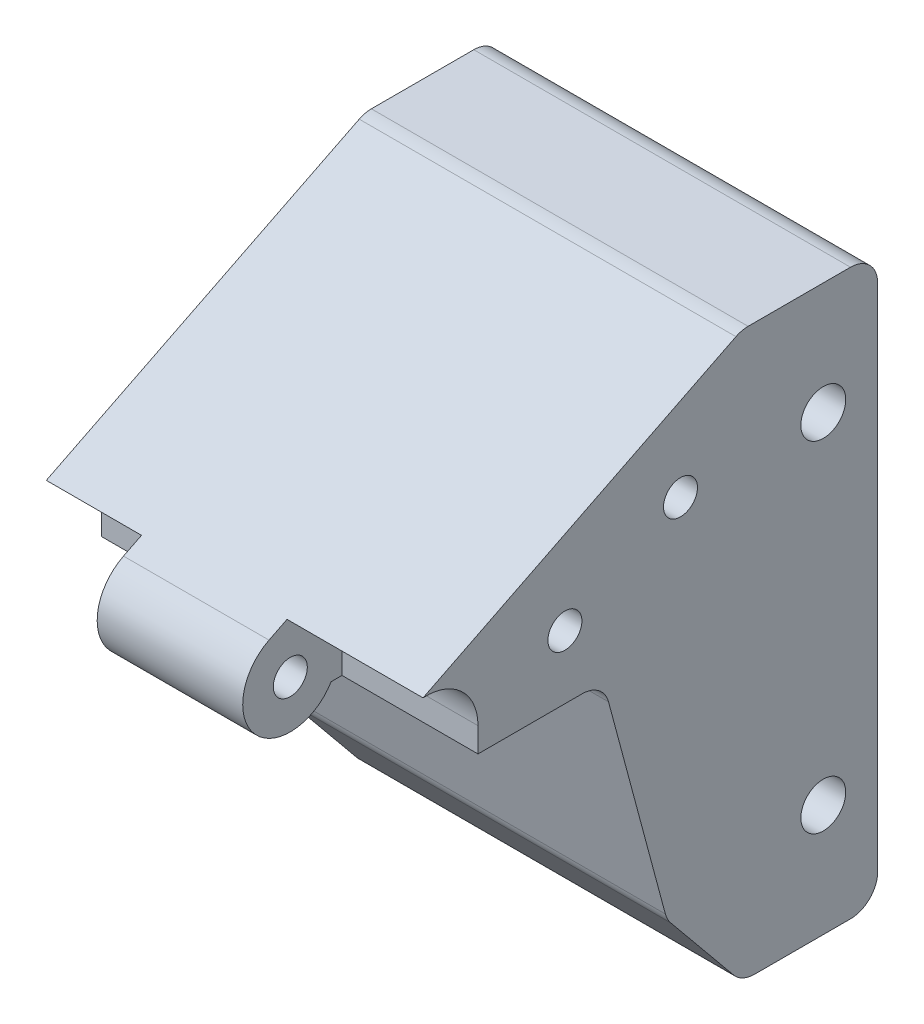
ISO-10303-21;
HEADER;
FILE_DESCRIPTION(('STEP AP214'),'2;1');
FILE_NAME('part.step','',(''),(''),'','','');
FILE_SCHEMA(('AUTOMOTIVE_DESIGN { 1 0 10303 214 1 1 1 1 }'));
ENDSEC;
DATA;
#1=APPLICATION_CONTEXT('core data for automotive mechanical design processes');
#2=APPLICATION_PROTOCOL_DEFINITION('international standard','automotive_design',2000,#1);
#3=PRODUCT_CONTEXT('',#1,'mechanical');
#4=PRODUCT('Part','Part','',(#3));
#5=PRODUCT_RELATED_PRODUCT_CATEGORY('part','',(#4));
#6=PRODUCT_DEFINITION_FORMATION('','',#4);
#7=PRODUCT_DEFINITION_CONTEXT('part definition',#1,'design');
#8=PRODUCT_DEFINITION('design','',#6,#7);
#9=PRODUCT_DEFINITION_SHAPE('','',#8);
#10=(LENGTH_UNIT() NAMED_UNIT(*) SI_UNIT(.MILLI.,.METRE.));
#11=(NAMED_UNIT(*) PLANE_ANGLE_UNIT() SI_UNIT($,.RADIAN.));
#12=(NAMED_UNIT(*) SI_UNIT($,.STERADIAN.) SOLID_ANGLE_UNIT());
#13=UNCERTAINTY_MEASURE_WITH_UNIT(LENGTH_MEASURE(1.E-05),#10,'distance_accuracy_value','');
#14=(GEOMETRIC_REPRESENTATION_CONTEXT(3) GLOBAL_UNCERTAINTY_ASSIGNED_CONTEXT((#13)) GLOBAL_UNIT_ASSIGNED_CONTEXT((#10,
#11,#12)) REPRESENTATION_CONTEXT('',''));
#15=CARTESIAN_POINT('',(0.,0.,0.));
#16=DIRECTION('',(0.,0.,1.));
#17=DIRECTION('',(1.,0.,0.));
#18=AXIS2_PLACEMENT_3D('',#15,#16,#17);
#19=CARTESIAN_POINT('',(-63.1917277768017,5.25000000000001,33.19));
#20=DIRECTION('',(1.,0.,0.));
#21=DIRECTION('',(0.,0.,-1.));
#22=AXIS2_PLACEMENT_3D('',#19,#20,#21);
#23=CYLINDRICAL_SURFACE('',#22,3.5);
#24=DIRECTION('',(1.,0.,0.));
#25=VECTOR('',#24,1.);
#26=CARTESIAN_POINT('',(-63.1917277768017,3.45000000000001,30.1883337960393));
#27=LINE('',#26,#25);
#28=CARTESIAN_POINT('',(-6.85,3.45000000000001,30.1883337960393));
#29=VERTEX_POINT('',#28);
#30=CARTESIAN_POINT('',(3.84999999999999,3.45000000000001,30.1883337960393));
#31=VERTEX_POINT('',#30);
#32=EDGE_CURVE('E251',#29,#31,#27,.T.);
#33=ORIENTED_EDGE('',*,*,#32,.T.);
#34=CARTESIAN_POINT('',(3.84999999999999,5.25000000000001,33.19));
#35=DIRECTION('',(1.,0.,0.));
#36=DIRECTION('',(0.,1.,0.));
#37=AXIS2_PLACEMENT_3D('',#34,#35,#36);
#38=CIRCLE('',#37,3.5);
#39=CARTESIAN_POINT('',(3.84999999999999,8.38090580389375,34.7544260439997));
#40=VERTEX_POINT('',#39);
#41=EDGE_CURVE('E180',#31,#40,#38,.F.);
#42=ORIENTED_EDGE('',*,*,#41,.T.);
#43=DIRECTION('',(1.,0.,0.));
#44=VECTOR('',#43,1.);
#45=CARTESIAN_POINT('',(-63.1917277768017,8.38090580389375,34.7544260439997));
#46=LINE('',#45,#44);
#47=CARTESIAN_POINT('',(-6.85,8.38090580389374,34.7544260439997));
#48=VERTEX_POINT('',#47);
#49=EDGE_CURVE('E245',#48,#40,#46,.T.);
#50=ORIENTED_EDGE('',*,*,#49,.F.);
#51=CARTESIAN_POINT('',(-6.85,5.25000000000001,33.19));
#52=DIRECTION('',(-1.,0.,0.));
#53=DIRECTION('',(0.,-1.,0.));
#54=AXIS2_PLACEMENT_3D('',#51,#52,#53);
#55=CIRCLE('',#54,3.5);
#56=EDGE_CURVE('E229',#48,#29,#55,.F.);
#57=ORIENTED_EDGE('',*,*,#56,.T.);
#58=EDGE_LOOP('',(#33,#42,#50,#57));
#59=FACE_BOUND('',#58,.T.);
#60=ADVANCED_FACE('F38',(#59),#23,.T.);
#61=CARTESIAN_POINT('',(-63.1917277768017,5.25000000000001,33.19));
#62=DIRECTION('',(1.,0.,0.));
#63=DIRECTION('',(0.,0.,-1.));
#64=AXIS2_PLACEMENT_3D('',#61,#62,#63);
#65=CYLINDRICAL_SURFACE('',#64,1.25);
#66=CARTESIAN_POINT('',(-6.85,5.25000000000001,33.19));
#67=DIRECTION('',(-1.,0.,0.));
#68=DIRECTION('',(0.,-1.,0.));
#69=AXIS2_PLACEMENT_3D('',#66,#67,#68);
#70=CIRCLE('',#69,1.25);
#71=CARTESIAN_POINT('',(-6.85,4.00000000000001,33.19));
#72=VERTEX_POINT('',#71);
#73=EDGE_CURVE('E215',#72,#72,#70,.F.);
#74=ORIENTED_EDGE('',*,*,#73,.F.);
#75=EDGE_LOOP('',(#74));
#76=FACE_BOUND('',#75,.T.);
#77=CARTESIAN_POINT('',(3.85,5.25000000000001,33.19));
#78=DIRECTION('',(1.,0.,0.));
#79=DIRECTION('',(0.,1.,0.));
#80=AXIS2_PLACEMENT_3D('',#77,#78,#79);
#81=CIRCLE('',#80,1.25);
#82=CARTESIAN_POINT('',(3.85,6.50000000000001,33.19));
#83=VERTEX_POINT('',#82);
#84=EDGE_CURVE('E195',#83,#83,#81,.F.);
#85=ORIENTED_EDGE('',*,*,#84,.F.);
#86=EDGE_LOOP('',(#85));
#87=FACE_BOUND('',#86,.T.);
#88=ADVANCED_FACE('F416',(#76,#87),#65,.F.);
#89=CARTESIAN_POINT('',(-63.1917277768017,3.45000000000001,0.));
#90=DIRECTION('',(0.,-1.,0.));
#91=DIRECTION('',(0.,0.,-1.));
#92=AXIS2_PLACEMENT_3D('',#89,#90,#91);
#93=PLANE('',#92);
#94=DIRECTION('',(0.,0.,1.));
#95=VECTOR('',#94,1.);
#96=CARTESIAN_POINT('',(-13.85,3.45000000000001,0.));
#97=LINE('',#96,#95);
#98=CARTESIAN_POINT('',(-13.85,3.45000000000001,21.7230535966999));
#99=VERTEX_POINT('',#98);
#100=CARTESIAN_POINT('',(-13.85,3.45000000000001,29.39));
#101=VERTEX_POINT('',#100);
#102=EDGE_CURVE('E253',#99,#101,#97,.T.);
#103=ORIENTED_EDGE('',*,*,#102,.F.);
#104=DIRECTION('',(1.,0.,0.));
#105=VECTOR('',#104,1.);
#106=CARTESIAN_POINT('',(-63.1917277768017,3.45000000000001,21.7230535966999));
#107=LINE('',#106,#105);
#108=CARTESIAN_POINT('',(13.85,3.45000000000001,21.7230535966999));
#109=VERTEX_POINT('',#108);
#110=EDGE_CURVE('E333',#99,#109,#107,.T.);
#111=ORIENTED_EDGE('',*,*,#110,.T.);
#112=DIRECTION('',(0.,0.,1.));
#113=VECTOR('',#112,1.);
#114=CARTESIAN_POINT('',(13.85,3.45000000000001,0.));
#115=LINE('',#114,#113);
#116=CARTESIAN_POINT('',(13.85,3.45000000000001,29.39));
#117=VERTEX_POINT('',#116);
#118=EDGE_CURVE('E200',#109,#117,#115,.T.);
#119=ORIENTED_EDGE('',*,*,#118,.T.);
#120=DIRECTION('',(1.,0.,0.));
#121=VECTOR('',#120,1.);
#122=CARTESIAN_POINT('',(3.85,3.45000000000001,29.39));
#123=LINE('',#122,#121);
#124=CARTESIAN_POINT('',(3.85,3.45000000000001,29.39));
#125=VERTEX_POINT('',#124);
#126=EDGE_CURVE('E191',#125,#117,#123,.T.);
#127=ORIENTED_EDGE('',*,*,#126,.F.);
#128=DIRECTION('',(0.,0.,-1.));
#129=VECTOR('',#128,1.);
#130=CARTESIAN_POINT('',(3.85,3.45000000000001,0.));
#131=LINE('',#130,#129);
#132=EDGE_CURVE('E174',#31,#125,#131,.T.);
#133=ORIENTED_EDGE('',*,*,#132,.F.);
#134=ORIENTED_EDGE('',*,*,#32,.F.);
#135=DIRECTION('',(0.,0.,-1.));
#136=VECTOR('',#135,1.);
#137=CARTESIAN_POINT('',(-6.85,3.45000000000001,0.));
#138=LINE('',#137,#136);
#139=CARTESIAN_POINT('',(-6.85,3.45000000000001,29.39));
#140=VERTEX_POINT('',#139);
#141=EDGE_CURVE('E225',#29,#140,#138,.T.);
#142=ORIENTED_EDGE('',*,*,#141,.T.);
#143=DIRECTION('',(-1.,0.,0.));
#144=VECTOR('',#143,1.);
#145=CARTESIAN_POINT('',(-6.85,3.45000000000001,29.39));
#146=LINE('',#145,#144);
#147=EDGE_CURVE('E222',#140,#101,#146,.T.);
#148=ORIENTED_EDGE('',*,*,#147,.T.);
#149=EDGE_LOOP('',(#103,#111,#119,#127,#133,#134,#142,#148));
#150=FACE_BOUND('',#149,.T.);
#151=ADVANCED_FACE('F197',(#150),#93,.T.);
#152=CARTESIAN_POINT('',(-13.85,20.75,10.));
#153=DIRECTION('',(1.,0.,0.));
#154=DIRECTION('',(0.,1.,0.));
#155=AXIS2_PLACEMENT_3D('',#152,#153,#154);
#156=PLANE('',#155);
#157=CARTESIAN_POINT('',(-13.85,8.10626133417407,22.9992433006019));
#158=DIRECTION('',(-1.,0.,0.));
#159=DIRECTION('',(0.,-1.,0.));
#160=AXIS2_PLACEMENT_3D('',#157,#158,#159);
#161=CIRCLE('',#160,1.25);
#162=CARTESIAN_POINT('',(-13.85,6.85626133417407,22.9992433006019));
#163=VERTEX_POINT('',#162);
#164=EDGE_CURVE('E458',#163,#163,#161,.T.);
#165=ORIENTED_EDGE('',*,*,#164,.F.);
#166=EDGE_LOOP('',(#165));
#167=FACE_BOUND('',#166,.T.);
#168=CARTESIAN_POINT('',(-13.85,12.3530954475528,14.5));
#169=DIRECTION('',(-1.,0.,0.));
#170=DIRECTION('',(0.,-1.,0.));
#171=AXIS2_PLACEMENT_3D('',#168,#169,#170);
#172=CIRCLE('',#171,1.25);
#173=CARTESIAN_POINT('',(-13.85,11.1030954475528,14.5));
#174=VERTEX_POINT('',#173);
#175=EDGE_CURVE('E462',#174,#174,#172,.T.);
#176=ORIENTED_EDGE('',*,*,#175,.F.);
#177=EDGE_LOOP('',(#176));
#178=FACE_BOUND('',#177,.T.);
#179=CARTESIAN_POINT('',(-13.85,-12.5,4.));
#180=DIRECTION('',(1.,0.,0.));
#181=DIRECTION('',(0.,0.,-1.));
#182=AXIS2_PLACEMENT_3D('',#179,#180,#181);
#183=CIRCLE('',#182,1.65);
#184=CARTESIAN_POINT('',(-13.85,-12.5,2.35));
#185=VERTEX_POINT('',#184);
#186=EDGE_CURVE('E257',#185,#185,#183,.T.);
#187=ORIENTED_EDGE('',*,*,#186,.T.);
#188=EDGE_LOOP('',(#187));
#189=FACE_BOUND('',#188,.T.);
#190=CARTESIAN_POINT('',(-13.85,12.5,4.));
#191=DIRECTION('',(1.,0.,0.));
#192=DIRECTION('',(0.,0.,-1.));
#193=AXIS2_PLACEMENT_3D('',#190,#191,#192);
#194=CIRCLE('',#193,1.65);
#195=CARTESIAN_POINT('',(-13.85,12.5,2.35));
#196=VERTEX_POINT('',#195);
#197=EDGE_CURVE('E269',#196,#196,#194,.T.);
#198=ORIENTED_EDGE('',*,*,#197,.T.);
#199=EDGE_LOOP('',(#198));
#200=FACE_BOUND('',#199,.T.);
#201=DIRECTION('',(0.,0.,-1.));
#202=VECTOR('',#201,1.);
#203=CARTESIAN_POINT('',(-13.85,-20.75,10.));
#204=LINE('',#203,#202);
#205=CARTESIAN_POINT('',(-13.85,-20.75,9.05422890354993));
#206=VERTEX_POINT('',#205);
#207=CARTESIAN_POINT('',(-13.85,-20.75,2.));
#208=VERTEX_POINT('',#207);
#209=EDGE_CURVE('E287',#206,#208,#204,.T.);
#210=ORIENTED_EDGE('',*,*,#209,.F.);
#211=CARTESIAN_POINT('',(-13.85,-18.75,9.05422890354993));
#212=DIRECTION('',(1.,0.,0.));
#213=DIRECTION('',(0.,1.,0.));
#214=AXIS2_PLACEMENT_3D('',#211,#212,#213);
#215=CIRCLE('',#214,2.);
#216=CARTESIAN_POINT('',(-13.85,-20.0189867567765,10.6000854981686));
#217=VERTEX_POINT('',#216);
#218=EDGE_CURVE('E322',#206,#217,#215,.F.);
#219=ORIENTED_EDGE('',*,*,#218,.T.);
#220=DIRECTION('',(0.,-0.772928297309314,-0.634493378388243));
#221=VECTOR('',#220,1.);
#222=CARTESIAN_POINT('',(-13.85,-13.257752195901,16.1503526750067));
#223=LINE('',#222,#221);
#224=CARTESIAN_POINT('',(-13.85,-14.3840113005057,15.2258116189879));
#225=VERTEX_POINT('',#224);
#226=EDGE_CURVE('E247',#225,#217,#223,.T.);
#227=ORIENTED_EDGE('',*,*,#226,.F.);
#228=CARTESIAN_POINT('',(-13.85,-13.1150245437292,13.6799550243692));
#229=DIRECTION('',(1.,0.,0.));
#230=DIRECTION('',(0.,1.,0.));
#231=AXIS2_PLACEMENT_3D('',#228,#229,#230);
#232=CIRCLE('',#231,2.);
#233=CARTESIAN_POINT('',(-13.85,-13.6325825968062,15.6118281210542));
#234=VERTEX_POINT('',#233);
#235=EDGE_CURVE('E57',#225,#234,#232,.F.);
#236=ORIENTED_EDGE('',*,*,#235,.T.);
#237=DIRECTION('',(0.,-0.965936548342484,-0.258779026538491));
#238=VECTOR('',#237,1.);
#239=CARTESIAN_POINT('',(-13.85,-4.815324368305,17.9740138205449));
#240=LINE('',#239,#238);
#241=CARTESIAN_POINT('',(-13.85,1.96755805307699,19.791180500015));
#242=VERTEX_POINT('',#241);
#243=EDGE_CURVE('E255',#242,#234,#240,.T.);
#244=ORIENTED_EDGE('',*,*,#243,.F.);
#245=CARTESIAN_POINT('',(-13.85,1.45000000000001,21.7230535966999));
#246=DIRECTION('',(1.,0.,0.));
#247=DIRECTION('',(0.,1.,0.));
#248=AXIS2_PLACEMENT_3D('',#245,#246,#247);
#249=CIRCLE('',#248,2.);
#250=EDGE_CURVE('E11',#242,#99,#249,.T.);
#251=ORIENTED_EDGE('',*,*,#250,.T.);
#252=ORIENTED_EDGE('',*,*,#102,.T.);
#253=DIRECTION('',(0.,1.,0.));
#254=VECTOR('',#253,1.);
#255=CARTESIAN_POINT('',(-13.85,0.,29.39));
#256=LINE('',#255,#254);
#257=CARTESIAN_POINT('',(-13.85,5.25000000000001,29.39));
#258=VERTEX_POINT('',#257);
#259=EDGE_CURVE('E212',#101,#258,#256,.T.);
#260=ORIENTED_EDGE('',*,*,#259,.T.);
#261=CARTESIAN_POINT('',(-13.85,5.25000000000001,33.19));
#262=DIRECTION('',(-1.,0.,0.));
#263=DIRECTION('',(0.,-1.,0.));
#264=AXIS2_PLACEMENT_3D('',#261,#262,#263);
#265=CIRCLE('',#264,3.8);
#266=CARTESIAN_POINT('',(-13.85,9.04237412576294,33.4306210511236));
#267=VERTEX_POINT('',#266);
#268=EDGE_CURVE('E208',#267,#258,#265,.T.);
#269=ORIENTED_EDGE('',*,*,#268,.F.);
#270=DIRECTION('',(0.,-0.446978869714198,0.89454451539821));
#271=VECTOR('',#270,1.);
#272=CARTESIAN_POINT('',(-13.85,20.6027801821194,10.2946329000457));
#273=LINE('',#272,#271);
#274=CARTESIAN_POINT('',(-13.85,20.5390890307964,10.4220988138858));
#275=VERTEX_POINT('',#274);
#276=EDGE_CURVE('E250',#275,#267,#273,.T.);
#277=ORIENTED_EDGE('',*,*,#276,.F.);
#278=CARTESIAN_POINT('',(-13.85,18.75,9.52814107445743));
#279=DIRECTION('',(1.,0.,0.));
#280=DIRECTION('',(0.,1.,0.));
#281=AXIS2_PLACEMENT_3D('',#278,#279,#280);
#282=CIRCLE('',#281,2.);
#283=CARTESIAN_POINT('',(-13.85,20.75,9.52814107445743));
#284=VERTEX_POINT('',#283);
#285=EDGE_CURVE('E315',#275,#284,#282,.F.);
#286=ORIENTED_EDGE('',*,*,#285,.T.);
#287=DIRECTION('',(0.,0.,-1.));
#288=VECTOR('',#287,1.);
#289=CARTESIAN_POINT('',(-13.85,20.75,10.));
#290=LINE('',#289,#288);
#291=CARTESIAN_POINT('',(-13.85,20.75,2.));
#292=VERTEX_POINT('',#291);
#293=EDGE_CURVE('E278',#284,#292,#290,.T.);
#294=ORIENTED_EDGE('',*,*,#293,.T.);
#295=CARTESIAN_POINT('',(-13.85,18.75,2.));
#296=DIRECTION('',(1.,0.,0.));
#297=DIRECTION('',(0.,1.,0.));
#298=AXIS2_PLACEMENT_3D('',#295,#296,#297);
#299=CIRCLE('',#298,2.);
#300=CARTESIAN_POINT('',(-13.85,18.75,0.));
#301=VERTEX_POINT('',#300);
#302=EDGE_CURVE('E317',#292,#301,#299,.F.);
#303=ORIENTED_EDGE('',*,*,#302,.T.);
#304=DIRECTION('',(0.,-1.,0.));
#305=VECTOR('',#304,1.);
#306=CARTESIAN_POINT('',(-13.85,20.75,0.));
#307=LINE('',#306,#305);
#308=CARTESIAN_POINT('',(-13.85,-18.75,0.));
#309=VERTEX_POINT('',#308);
#310=EDGE_CURVE('E272',#301,#309,#307,.T.);
#311=ORIENTED_EDGE('',*,*,#310,.T.);
#312=CARTESIAN_POINT('',(-13.85,-18.75,2.));
#313=DIRECTION('',(1.,0.,0.));
#314=DIRECTION('',(0.,1.,0.));
#315=AXIS2_PLACEMENT_3D('',#312,#313,#314);
#316=CIRCLE('',#315,2.);
#317=EDGE_CURVE('E319',#309,#208,#316,.F.);
#318=ORIENTED_EDGE('',*,*,#317,.T.);
#319=EDGE_LOOP('',(#210,#219,#227,#236,#244,#251,#252,#260,#269,#277,#286,#294,#303,#311,#318));
#320=FACE_BOUND('',#319,.T.);
#321=ADVANCED_FACE('F355',(#167,#178,#189,#200,#320),#156,.F.);
#322=CARTESIAN_POINT('',(13.85,-20.75,10.));
#323=DIRECTION('',(0.,1.,0.));
#324=DIRECTION('',(-1.,0.,0.));
#325=AXIS2_PLACEMENT_3D('',#322,#323,#324);
#326=PLANE('',#325);
#327=DIRECTION('',(0.,0.,-1.));
#328=VECTOR('',#327,1.);
#329=CARTESIAN_POINT('',(13.85,-20.75,10.));
#330=LINE('',#329,#328);
#331=CARTESIAN_POINT('',(13.85,-20.75,9.05422890354993));
#332=VERTEX_POINT('',#331);
#333=CARTESIAN_POINT('',(13.85,-20.75,2.));
#334=VERTEX_POINT('',#333);
#335=EDGE_CURVE('E284',#332,#334,#330,.T.);
#336=ORIENTED_EDGE('',*,*,#335,.F.);
#337=DIRECTION('',(1.,0.,0.));
#338=VECTOR('',#337,1.);
#339=CARTESIAN_POINT('',(13.85,-20.75,9.05422890354993));
#340=LINE('',#339,#338);
#341=EDGE_CURVE('E313',#332,#206,#340,.F.);
#342=ORIENTED_EDGE('',*,*,#341,.T.);
#343=ORIENTED_EDGE('',*,*,#209,.T.);
#344=DIRECTION('',(1.,0.,0.));
#345=VECTOR('',#344,1.);
#346=CARTESIAN_POINT('',(13.85,-20.75,2.));
#347=LINE('',#346,#345);
#348=EDGE_CURVE('E310',#208,#334,#347,.T.);
#349=ORIENTED_EDGE('',*,*,#348,.T.);
#350=EDGE_LOOP('',(#336,#342,#343,#349));
#351=FACE_BOUND('',#350,.T.);
#352=ADVANCED_FACE('F395',(#351),#326,.F.);
#353=CARTESIAN_POINT('',(13.85,20.75,10.));
#354=DIRECTION('',(-1.,0.,0.));
#355=DIRECTION('',(0.,-1.,0.));
#356=AXIS2_PLACEMENT_3D('',#353,#354,#355);
#357=PLANE('',#356);
#358=CARTESIAN_POINT('',(13.85,8.10626133417408,22.9992433006019));
#359=DIRECTION('',(-1.,0.,0.));
#360=DIRECTION('',(0.,-1.,0.));
#361=AXIS2_PLACEMENT_3D('',#358,#359,#360);
#362=CIRCLE('',#361,1.25);
#363=CARTESIAN_POINT('',(13.85,6.85626133417407,22.9992433006019));
#364=VERTEX_POINT('',#363);
#365=EDGE_CURVE('E474',#364,#364,#362,.T.);
#366=ORIENTED_EDGE('',*,*,#365,.T.);
#367=EDGE_LOOP('',(#366));
#368=FACE_BOUND('',#367,.T.);
#369=CARTESIAN_POINT('',(13.85,12.3530954475528,14.5));
#370=DIRECTION('',(-1.,0.,0.));
#371=DIRECTION('',(0.,-1.,0.));
#372=AXIS2_PLACEMENT_3D('',#369,#370,#371);
#373=CIRCLE('',#372,1.25);
#374=CARTESIAN_POINT('',(13.85,11.1030954475528,14.5));
#375=VERTEX_POINT('',#374);
#376=EDGE_CURVE('E473',#375,#375,#373,.T.);
#377=ORIENTED_EDGE('',*,*,#376,.T.);
#378=EDGE_LOOP('',(#377));
#379=FACE_BOUND('',#378,.T.);
#380=CARTESIAN_POINT('',(13.85,-12.5,4.));
#381=DIRECTION('',(1.,0.,0.));
#382=DIRECTION('',(0.,0.,-1.));
#383=AXIS2_PLACEMENT_3D('',#380,#381,#382);
#384=CIRCLE('',#383,1.65);
#385=CARTESIAN_POINT('',(13.85,-12.5,2.35));
#386=VERTEX_POINT('',#385);
#387=EDGE_CURVE('E263',#386,#386,#384,.T.);
#388=ORIENTED_EDGE('',*,*,#387,.F.);
#389=EDGE_LOOP('',(#388));
#390=FACE_BOUND('',#389,.T.);
#391=CARTESIAN_POINT('',(13.85,12.5,4.));
#392=DIRECTION('',(1.,0.,0.));
#393=DIRECTION('',(0.,0.,-1.));
#394=AXIS2_PLACEMENT_3D('',#391,#392,#393);
#395=CIRCLE('',#394,1.65);
#396=CARTESIAN_POINT('',(13.85,12.5,2.35));
#397=VERTEX_POINT('',#396);
#398=EDGE_CURVE('E266',#397,#397,#395,.T.);
#399=ORIENTED_EDGE('',*,*,#398,.F.);
#400=EDGE_LOOP('',(#399));
#401=FACE_BOUND('',#400,.T.);
#402=DIRECTION('',(0.,-0.772928297309314,-0.634493378388243));
#403=VECTOR('',#402,1.);
#404=CARTESIAN_POINT('',(13.85,-13.257752195901,16.1503526750066));
#405=LINE('',#404,#403);
#406=CARTESIAN_POINT('',(13.85,-14.3840113005057,15.2258116189879));
#407=VERTEX_POINT('',#406);
#408=CARTESIAN_POINT('',(13.85,-20.0189867567765,10.6000854981686));
#409=VERTEX_POINT('',#408);
#410=EDGE_CURVE('E240',#407,#409,#405,.T.);
#411=ORIENTED_EDGE('',*,*,#410,.T.);
#412=CARTESIAN_POINT('',(13.85,-18.75,9.05422890354993));
#413=DIRECTION('',(-1.,0.,0.));
#414=DIRECTION('',(0.,-1.,0.));
#415=AXIS2_PLACEMENT_3D('',#412,#413,#414);
#416=CIRCLE('',#415,2.);
#417=EDGE_CURVE('E308',#409,#332,#416,.F.);
#418=ORIENTED_EDGE('',*,*,#417,.T.);
#419=ORIENTED_EDGE('',*,*,#335,.T.);
#420=CARTESIAN_POINT('',(13.85,-18.75,2.));
#421=DIRECTION('',(-1.,0.,0.));
#422=DIRECTION('',(0.,-1.,0.));
#423=AXIS2_PLACEMENT_3D('',#420,#421,#422);
#424=CIRCLE('',#423,2.);
#425=CARTESIAN_POINT('',(13.85,-18.75,0.));
#426=VERTEX_POINT('',#425);
#427=EDGE_CURVE('E304',#334,#426,#424,.F.);
#428=ORIENTED_EDGE('',*,*,#427,.T.);
#429=DIRECTION('',(0.,1.,0.));
#430=VECTOR('',#429,1.);
#431=CARTESIAN_POINT('',(13.85,20.75,0.));
#432=LINE('',#431,#430);
#433=CARTESIAN_POINT('',(13.85,18.75,0.));
#434=VERTEX_POINT('',#433);
#435=EDGE_CURVE('E275',#426,#434,#432,.T.);
#436=ORIENTED_EDGE('',*,*,#435,.T.);
#437=CARTESIAN_POINT('',(13.85,18.75,2.));
#438=DIRECTION('',(-1.,0.,0.));
#439=DIRECTION('',(0.,-1.,0.));
#440=AXIS2_PLACEMENT_3D('',#437,#438,#439);
#441=CIRCLE('',#440,2.);
#442=CARTESIAN_POINT('',(13.85,20.75,2.));
#443=VERTEX_POINT('',#442);
#444=EDGE_CURVE('E302',#434,#443,#441,.F.);
#445=ORIENTED_EDGE('',*,*,#444,.T.);
#446=DIRECTION('',(0.,0.,-1.));
#447=VECTOR('',#446,1.);
#448=CARTESIAN_POINT('',(13.85,20.75,10.));
#449=LINE('',#448,#447);
#450=CARTESIAN_POINT('',(13.85,20.75,9.52814107445743));
#451=VERTEX_POINT('',#450);
#452=EDGE_CURVE('E281',#451,#443,#449,.T.);
#453=ORIENTED_EDGE('',*,*,#452,.F.);
#454=CARTESIAN_POINT('',(13.85,18.75,9.52814107445743));
#455=DIRECTION('',(-1.,0.,0.));
#456=DIRECTION('',(0.,-1.,0.));
#457=AXIS2_PLACEMENT_3D('',#454,#455,#456);
#458=CIRCLE('',#457,2.);
#459=CARTESIAN_POINT('',(13.85,20.5390890307964,10.4220988138858));
#460=VERTEX_POINT('',#459);
#461=EDGE_CURVE('E300',#451,#460,#458,.F.);
#462=ORIENTED_EDGE('',*,*,#461,.T.);
#463=DIRECTION('',(0.,-0.446978869714198,0.89454451539821));
#464=VECTOR('',#463,1.);
#465=CARTESIAN_POINT('',(13.85,20.6027801821194,10.2946329000457));
#466=LINE('',#465,#464);
#467=CARTESIAN_POINT('',(13.85,9.04237412576295,33.4306210511236));
#468=VERTEX_POINT('',#467);
#469=EDGE_CURVE('E243',#460,#468,#466,.T.);
#470=ORIENTED_EDGE('',*,*,#469,.T.);
#471=CARTESIAN_POINT('',(13.85,5.25000000000001,33.19));
#472=DIRECTION('',(1.,0.,0.));
#473=DIRECTION('',(0.,1.,0.));
#474=AXIS2_PLACEMENT_3D('',#471,#472,#473);
#475=CIRCLE('',#474,3.8);
#476=CARTESIAN_POINT('',(13.85,5.25000000000001,29.39));
#477=VERTEX_POINT('',#476);
#478=EDGE_CURVE('E477',#477,#468,#475,.T.);
#479=ORIENTED_EDGE('',*,*,#478,.F.);
#480=DIRECTION('',(0.,1.,0.));
#481=VECTOR('',#480,1.);
#482=CARTESIAN_POINT('',(13.85,0.,29.39));
#483=LINE('',#482,#481);
#484=EDGE_CURVE('E483',#117,#477,#483,.T.);
#485=ORIENTED_EDGE('',*,*,#484,.F.);
#486=ORIENTED_EDGE('',*,*,#118,.F.);
#487=CARTESIAN_POINT('',(13.85,1.45000000000001,21.7230535966999));
#488=DIRECTION('',(-1.,0.,0.));
#489=DIRECTION('',(0.,-1.,0.));
#490=AXIS2_PLACEMENT_3D('',#487,#488,#489);
#491=CIRCLE('',#490,2.);
#492=CARTESIAN_POINT('',(13.85,1.96755805307699,19.791180500015));
#493=VERTEX_POINT('',#492);
#494=EDGE_CURVE('E46',#109,#493,#491,.T.);
#495=ORIENTED_EDGE('',*,*,#494,.T.);
#496=DIRECTION('',(0.,-0.965936548342484,-0.258779026538491));
#497=VECTOR('',#496,1.);
#498=CARTESIAN_POINT('',(13.85,-4.81532436830501,17.9740138205449));
#499=LINE('',#498,#497);
#500=CARTESIAN_POINT('',(13.85,-13.6325825968062,15.6118281210542));
#501=VERTEX_POINT('',#500);
#502=EDGE_CURVE('E237',#493,#501,#499,.T.);
#503=ORIENTED_EDGE('',*,*,#502,.T.);
#504=CARTESIAN_POINT('',(13.85,-13.1150245437292,13.6799550243692));
#505=DIRECTION('',(-1.,0.,0.));
#506=DIRECTION('',(0.,-1.,0.));
#507=AXIS2_PLACEMENT_3D('',#504,#505,#506);
#508=CIRCLE('',#507,2.);
#509=EDGE_CURVE('E306',#501,#407,#508,.F.);
#510=ORIENTED_EDGE('',*,*,#509,.T.);
#511=EDGE_LOOP('',(#411,#418,#419,#428,#436,#445,#453,#462,#470,#479,#485,#486,#495,#503,#510));
#512=FACE_BOUND('',#511,.T.);
#513=ADVANCED_FACE('F344',(#368,#379,#390,#401,#512),#357,.F.);
#514=CARTESIAN_POINT('',(13.85,20.75,10.));
#515=DIRECTION('',(0.,-1.,0.));
#516=DIRECTION('',(0.,0.,-1.));
#517=AXIS2_PLACEMENT_3D('',#514,#515,#516);
#518=PLANE('',#517);
#519=ORIENTED_EDGE('',*,*,#452,.T.);
#520=DIRECTION('',(-1.,0.,0.));
#521=VECTOR('',#520,1.);
#522=CARTESIAN_POINT('',(-13.85,20.75,2.));
#523=LINE('',#522,#521);
#524=EDGE_CURVE('E337',#443,#292,#523,.T.);
#525=ORIENTED_EDGE('',*,*,#524,.T.);
#526=ORIENTED_EDGE('',*,*,#293,.F.);
#527=DIRECTION('',(-1.,0.,0.));
#528=VECTOR('',#527,1.);
#529=CARTESIAN_POINT('',(13.85,20.75,9.52814107445743));
#530=LINE('',#529,#528);
#531=EDGE_CURVE('E335',#284,#451,#530,.F.);
#532=ORIENTED_EDGE('',*,*,#531,.T.);
#533=EDGE_LOOP('',(#519,#525,#526,#532));
#534=FACE_BOUND('',#533,.T.);
#535=ADVANCED_FACE('F377',(#534),#518,.F.);
#536=CARTESIAN_POINT('',(0.,0.,0.));
#537=DIRECTION('',(0.,0.,-1.));
#538=DIRECTION('',(-1.,0.,0.));
#539=AXIS2_PLACEMENT_3D('',#536,#537,#538);
#540=PLANE('',#539);
#541=ORIENTED_EDGE('',*,*,#435,.F.);
#542=DIRECTION('',(1.,0.,0.));
#543=VECTOR('',#542,1.);
#544=CARTESIAN_POINT('',(-13.85,-18.75,0.));
#545=LINE('',#544,#543);
#546=EDGE_CURVE('E331',#426,#309,#545,.F.);
#547=ORIENTED_EDGE('',*,*,#546,.T.);
#548=ORIENTED_EDGE('',*,*,#310,.F.);
#549=DIRECTION('',(-1.,0.,0.));
#550=VECTOR('',#549,1.);
#551=CARTESIAN_POINT('',(13.85,18.75,0.));
#552=LINE('',#551,#550);
#553=EDGE_CURVE('E329',#301,#434,#552,.F.);
#554=ORIENTED_EDGE('',*,*,#553,.T.);
#555=EDGE_LOOP('',(#541,#547,#548,#554));
#556=FACE_BOUND('',#555,.T.);
#557=ADVANCED_FACE('F387',(#556),#540,.T.);
#558=CARTESIAN_POINT('',(-13.85,12.5,4.));
#559=DIRECTION('',(1.,0.,0.));
#560=DIRECTION('',(0.,0.,-1.));
#561=AXIS2_PLACEMENT_3D('',#558,#559,#560);
#562=CYLINDRICAL_SURFACE('',#561,1.65);
#563=ORIENTED_EDGE('',*,*,#197,.F.);
#564=EDGE_LOOP('',(#563));
#565=FACE_BOUND('',#564,.T.);
#566=ORIENTED_EDGE('',*,*,#398,.T.);
#567=EDGE_LOOP('',(#566));
#568=FACE_BOUND('',#567,.T.);
#569=ADVANCED_FACE('F436',(#565,#568),#562,.F.);
#570=CARTESIAN_POINT('',(-13.85,-12.5,4.));
#571=DIRECTION('',(1.,0.,0.));
#572=DIRECTION('',(0.,0.,-1.));
#573=AXIS2_PLACEMENT_3D('',#570,#571,#572);
#574=CYLINDRICAL_SURFACE('',#573,1.65);
#575=ORIENTED_EDGE('',*,*,#186,.F.);
#576=EDGE_LOOP('',(#575));
#577=FACE_BOUND('',#576,.T.);
#578=ORIENTED_EDGE('',*,*,#387,.T.);
#579=EDGE_LOOP('',(#578));
#580=FACE_BOUND('',#579,.T.);
#581=ADVANCED_FACE('F431',(#577,#580),#574,.F.);
#582=CARTESIAN_POINT('',(-63.1917277768017,-13.257752195901,16.1503526750066));
#583=DIRECTION('',(0.,0.634493378388243,-0.772928297309314));
#584=DIRECTION('',(0.,0.772928297309314,0.634493378388243));
#585=AXIS2_PLACEMENT_3D('',#582,#583,#584);
#586=PLANE('',#585);
#587=ORIENTED_EDGE('',*,*,#226,.T.);
#588=DIRECTION('',(1.,0.,0.));
#589=VECTOR('',#588,1.);
#590=CARTESIAN_POINT('',(-63.1917277768017,-20.0189867567765,10.6000854981685));
#591=LINE('',#590,#589);
#592=EDGE_CURVE('E297',#217,#409,#591,.T.);
#593=ORIENTED_EDGE('',*,*,#592,.T.);
#594=ORIENTED_EDGE('',*,*,#410,.F.);
#595=DIRECTION('',(1.,0.,0.));
#596=VECTOR('',#595,1.);
#597=CARTESIAN_POINT('',(-63.1917277768017,-14.3840113005057,15.2258116189879));
#598=LINE('',#597,#596);
#599=EDGE_CURVE('E295',#407,#225,#598,.F.);
#600=ORIENTED_EDGE('',*,*,#599,.T.);
#601=EDGE_LOOP('',(#587,#593,#594,#600));
#602=FACE_BOUND('',#601,.T.);
#603=ADVANCED_FACE('F401',(#602),#586,.F.);
#604=CARTESIAN_POINT('',(-63.1917277768017,20.6027801821194,10.2946329000457));
#605=DIRECTION('',(0.,-0.89454451539821,-0.446978869714198));
#606=DIRECTION('',(0.,0.446978869714198,-0.89454451539821));
#607=AXIS2_PLACEMENT_3D('',#604,#605,#606);
#608=PLANE('',#607);
#609=ORIENTED_EDGE('',*,*,#469,.F.);
#610=DIRECTION('',(-1.,0.,0.));
#611=VECTOR('',#610,1.);
#612=CARTESIAN_POINT('',(-63.1917277768017,20.5390890307964,10.4220988138858));
#613=LINE('',#612,#611);
#614=EDGE_CURVE('E340',#460,#275,#613,.T.);
#615=ORIENTED_EDGE('',*,*,#614,.T.);
#616=ORIENTED_EDGE('',*,*,#276,.T.);
#617=DIRECTION('',(-1.,0.,0.));
#618=VECTOR('',#617,1.);
#619=CARTESIAN_POINT('',(-6.85,9.04237412576294,33.4306210511236));
#620=LINE('',#619,#618);
#621=CARTESIAN_POINT('',(-6.85,9.04237412576294,33.4306210511237));
#622=VERTEX_POINT('',#621);
#623=EDGE_CURVE('E234',#267,#622,#620,.F.);
#624=ORIENTED_EDGE('',*,*,#623,.T.);
#625=DIRECTION('',(0.,0.446978869714198,-0.89454451539821));
#626=VECTOR('',#625,1.);
#627=CARTESIAN_POINT('',(-6.85,20.6027801821194,10.2946329000457));
#628=LINE('',#627,#626);
#629=EDGE_CURVE('E232',#48,#622,#628,.T.);
#630=ORIENTED_EDGE('',*,*,#629,.F.);
#631=ORIENTED_EDGE('',*,*,#49,.T.);
#632=DIRECTION('',(0.,-0.446978869714198,0.89454451539821));
#633=VECTOR('',#632,1.);
#634=CARTESIAN_POINT('',(3.84999999999999,20.6027801821194,10.2946329000457));
#635=LINE('',#634,#633);
#636=CARTESIAN_POINT('',(3.85,9.04237412576295,33.4306210511236));
#637=VERTEX_POINT('',#636);
#638=EDGE_CURVE('E290',#637,#40,#635,.T.);
#639=ORIENTED_EDGE('',*,*,#638,.F.);
#640=DIRECTION('',(1.,0.,0.));
#641=VECTOR('',#640,1.);
#642=CARTESIAN_POINT('',(3.85,9.04237412576295,33.4306210511236));
#643=LINE('',#642,#641);
#644=EDGE_CURVE('E292',#637,#468,#643,.T.);
#645=ORIENTED_EDGE('',*,*,#644,.T.);
#646=EDGE_LOOP('',(#609,#615,#616,#624,#630,#631,#639,#645));
#647=FACE_BOUND('',#646,.T.);
#648=ADVANCED_FACE('F369',(#647),#608,.F.);
#649=CARTESIAN_POINT('',(-63.1917277768017,-4.81532436830501,17.9740138205449));
#650=DIRECTION('',(0.,0.258779026538491,-0.965936548342484));
#651=DIRECTION('',(0.,0.965936548342484,0.258779026538491));
#652=AXIS2_PLACEMENT_3D('',#649,#650,#651);
#653=PLANE('',#652);
#654=ORIENTED_EDGE('',*,*,#243,.T.);
#655=DIRECTION('',(1.,0.,0.));
#656=VECTOR('',#655,1.);
#657=CARTESIAN_POINT('',(-63.1917277768017,-13.6325825968062,15.6118281210542));
#658=LINE('',#657,#656);
#659=EDGE_CURVE('E326',#234,#501,#658,.T.);
#660=ORIENTED_EDGE('',*,*,#659,.T.);
#661=ORIENTED_EDGE('',*,*,#502,.F.);
#662=DIRECTION('',(1.,0.,0.));
#663=VECTOR('',#662,1.);
#664=CARTESIAN_POINT('',(-63.1917277768017,1.96755805307699,19.791180500015));
#665=LINE('',#664,#663);
#666=EDGE_CURVE('E324',#493,#242,#665,.F.);
#667=ORIENTED_EDGE('',*,*,#666,.T.);
#668=EDGE_LOOP('',(#654,#660,#661,#667));
#669=FACE_BOUND('',#668,.T.);
#670=ADVANCED_FACE('F349',(#669),#653,.F.);
#671=CARTESIAN_POINT('',(-6.85,5.25000000000001,33.19));
#672=DIRECTION('',(-1.,0.,0.));
#673=DIRECTION('',(0.,-1.,0.));
#674=AXIS2_PLACEMENT_3D('',#671,#672,#673);
#675=CYLINDRICAL_SURFACE('',#674,3.8);
#676=ORIENTED_EDGE('',*,*,#268,.T.);
#677=DIRECTION('',(-1.,0.,0.));
#678=VECTOR('',#677,1.);
#679=CARTESIAN_POINT('',(-6.85,5.25000000000001,29.39));
#680=LINE('',#679,#678);
#681=CARTESIAN_POINT('',(-6.85,5.25000000000001,29.39));
#682=VERTEX_POINT('',#681);
#683=EDGE_CURVE('E218',#682,#258,#680,.T.);
#684=ORIENTED_EDGE('',*,*,#683,.F.);
#685=CARTESIAN_POINT('',(-6.85,5.25000000000001,33.19));
#686=DIRECTION('',(-1.,0.,0.));
#687=DIRECTION('',(0.,-1.,0.));
#688=AXIS2_PLACEMENT_3D('',#685,#686,#687);
#689=CIRCLE('',#688,3.8);
#690=EDGE_CURVE('E209',#622,#682,#689,.T.);
#691=ORIENTED_EDGE('',*,*,#690,.F.);
#692=ORIENTED_EDGE('',*,*,#623,.F.);
#693=EDGE_LOOP('',(#676,#684,#691,#692));
#694=FACE_BOUND('',#693,.T.);
#695=ADVANCED_FACE('F363',(#694),#675,.F.);
#696=CARTESIAN_POINT('',(-6.85,0.,0.));
#697=DIRECTION('',(-1.,0.,0.));
#698=DIRECTION('',(0.,-1.,0.));
#699=AXIS2_PLACEMENT_3D('',#696,#697,#698);
#700=PLANE('',#699);
#701=ORIENTED_EDGE('',*,*,#73,.T.);
#702=EDGE_LOOP('',(#701));
#703=FACE_BOUND('',#702,.T.);
#704=ORIENTED_EDGE('',*,*,#629,.T.);
#705=ORIENTED_EDGE('',*,*,#690,.T.);
#706=DIRECTION('',(0.,1.,0.));
#707=VECTOR('',#706,1.);
#708=CARTESIAN_POINT('',(-6.85,0.,29.39));
#709=LINE('',#708,#707);
#710=EDGE_CURVE('E211',#140,#682,#709,.T.);
#711=ORIENTED_EDGE('',*,*,#710,.F.);
#712=ORIENTED_EDGE('',*,*,#141,.F.);
#713=ORIENTED_EDGE('',*,*,#56,.F.);
#714=EDGE_LOOP('',(#704,#705,#711,#712,#713));
#715=FACE_BOUND('',#714,.T.);
#716=ADVANCED_FACE('F493',(#703,#715),#700,.T.);
#717=CARTESIAN_POINT('',(-6.85,0.,29.39));
#718=DIRECTION('',(0.,0.,1.));
#719=DIRECTION('',(0.,-1.,0.));
#720=AXIS2_PLACEMENT_3D('',#717,#718,#719);
#721=PLANE('',#720);
#722=ORIENTED_EDGE('',*,*,#259,.F.);
#723=ORIENTED_EDGE('',*,*,#147,.F.);
#724=ORIENTED_EDGE('',*,*,#710,.T.);
#725=ORIENTED_EDGE('',*,*,#683,.T.);
#726=EDGE_LOOP('',(#722,#723,#724,#725));
#727=FACE_BOUND('',#726,.T.);
#728=ADVANCED_FACE('F358',(#727),#721,.T.);
#729=CARTESIAN_POINT('',(3.85,5.25000000000001,33.19));
#730=DIRECTION('',(1.,0.,0.));
#731=DIRECTION('',(0.,1.,0.));
#732=AXIS2_PLACEMENT_3D('',#729,#730,#731);
#733=CYLINDRICAL_SURFACE('',#732,3.8);
#734=CARTESIAN_POINT('',(3.85,5.25000000000001,33.19));
#735=DIRECTION('',(1.,0.,0.));
#736=DIRECTION('',(0.,1.,0.));
#737=AXIS2_PLACEMENT_3D('',#734,#735,#736);
#738=CIRCLE('',#737,3.8);
#739=CARTESIAN_POINT('',(3.85,5.25000000000001,29.39));
#740=VERTEX_POINT('',#739);
#741=EDGE_CURVE('E185',#740,#637,#738,.T.);
#742=ORIENTED_EDGE('',*,*,#741,.F.);
#743=DIRECTION('',(1.,0.,0.));
#744=VECTOR('',#743,1.);
#745=CARTESIAN_POINT('',(3.85,5.25000000000001,29.39));
#746=LINE('',#745,#744);
#747=EDGE_CURVE('E193',#740,#477,#746,.T.);
#748=ORIENTED_EDGE('',*,*,#747,.T.);
#749=ORIENTED_EDGE('',*,*,#478,.T.);
#750=ORIENTED_EDGE('',*,*,#644,.F.);
#751=EDGE_LOOP('',(#742,#748,#749,#750));
#752=FACE_BOUND('',#751,.T.);
#753=ADVANCED_FACE('F489',(#752),#733,.F.);
#754=CARTESIAN_POINT('',(3.85,0.,29.39));
#755=DIRECTION('',(0.,0.,-1.));
#756=DIRECTION('',(0.,1.,0.));
#757=AXIS2_PLACEMENT_3D('',#754,#755,#756);
#758=PLANE('',#757);
#759=ORIENTED_EDGE('',*,*,#484,.T.);
#760=ORIENTED_EDGE('',*,*,#747,.F.);
#761=DIRECTION('',(0.,1.,0.));
#762=VECTOR('',#761,1.);
#763=CARTESIAN_POINT('',(3.85,0.,29.39));
#764=LINE('',#763,#762);
#765=EDGE_CURVE('E178',#125,#740,#764,.T.);
#766=ORIENTED_EDGE('',*,*,#765,.F.);
#767=ORIENTED_EDGE('',*,*,#126,.T.);
#768=EDGE_LOOP('',(#759,#760,#766,#767));
#769=FACE_BOUND('',#768,.T.);
#770=ADVANCED_FACE('F190',(#769),#758,.F.);
#771=CARTESIAN_POINT('',(3.85,0.,0.));
#772=DIRECTION('',(1.,0.,0.));
#773=DIRECTION('',(0.,1.,0.));
#774=AXIS2_PLACEMENT_3D('',#771,#772,#773);
#775=PLANE('',#774);
#776=ORIENTED_EDGE('',*,*,#132,.T.);
#777=ORIENTED_EDGE('',*,*,#765,.T.);
#778=ORIENTED_EDGE('',*,*,#741,.T.);
#779=ORIENTED_EDGE('',*,*,#638,.T.);
#780=ORIENTED_EDGE('',*,*,#41,.F.);
#781=EDGE_LOOP('',(#776,#777,#778,#779,#780));
#782=FACE_BOUND('',#781,.T.);
#783=ORIENTED_EDGE('',*,*,#84,.T.);
#784=EDGE_LOOP('',(#783));
#785=FACE_BOUND('',#784,.T.);
#786=ADVANCED_FACE('F176',(#782,#785),#775,.T.);
#787=CARTESIAN_POINT('',(13.85,12.3530954475528,14.5));
#788=DIRECTION('',(-1.,0.,0.));
#789=DIRECTION('',(0.,-1.,0.));
#790=AXIS2_PLACEMENT_3D('',#787,#788,#789);
#791=CYLINDRICAL_SURFACE('',#790,1.25);
#792=CARTESIAN_POINT('',(13.85,11.1030954475528,14.5));
#793=CARTESIAN_POINT('',(13.5614583333333,11.1030954475528,14.5));
#794=CARTESIAN_POINT('',(13.2729166666667,11.1030954475528,14.5));
#795=CARTESIAN_POINT('',(12.6958333333333,11.1030954475528,14.5));
#796=CARTESIAN_POINT('',(12.4072916666667,11.1030954475528,14.5));
#797=CARTESIAN_POINT('',(11.8302083333333,11.1030954475528,14.5));
#798=CARTESIAN_POINT('',(11.5416666666667,11.1030954475528,14.5));
#799=CARTESIAN_POINT('',(10.9645833333333,11.1030954475528,14.5));
#800=CARTESIAN_POINT('',(10.6760416666667,11.1030954475528,14.5));
#801=CARTESIAN_POINT('',(10.0989583333333,11.1030954475528,14.5));
#802=CARTESIAN_POINT('',(9.81041666666667,11.1030954475528,14.5));
#803=CARTESIAN_POINT('',(9.23333333333334,11.1030954475528,14.5));
#804=CARTESIAN_POINT('',(8.94479166666667,11.1030954475528,14.5));
#805=CARTESIAN_POINT('',(8.36770833333334,11.1030954475528,14.5));
#806=CARTESIAN_POINT('',(8.07916666666667,11.1030954475528,14.5));
#807=CARTESIAN_POINT('',(7.50208333333333,11.1030954475528,14.5));
#808=CARTESIAN_POINT('',(7.21354166666667,11.1030954475528,14.5));
#809=CARTESIAN_POINT('',(6.63645833333334,11.1030954475528,14.5));
#810=CARTESIAN_POINT('',(6.34791666666667,11.1030954475528,14.5));
#811=CARTESIAN_POINT('',(5.77083333333334,11.1030954475528,14.5));
#812=CARTESIAN_POINT('',(5.48229166666667,11.1030954475528,14.5));
#813=CARTESIAN_POINT('',(4.90520833333334,11.1030954475528,14.5));
#814=CARTESIAN_POINT('',(4.61666666666667,11.1030954475528,14.5));
#815=CARTESIAN_POINT('',(4.03958333333334,11.1030954475528,14.5));
#816=CARTESIAN_POINT('',(3.75104166666667,11.1030954475528,14.5));
#817=CARTESIAN_POINT('',(3.17395833333334,11.1030954475528,14.5));
#818=CARTESIAN_POINT('',(2.88541666666667,11.1030954475528,14.5));
#819=CARTESIAN_POINT('',(2.30833333333334,11.1030954475528,14.5));
#820=CARTESIAN_POINT('',(2.01979166666667,11.1030954475528,14.5));
#821=CARTESIAN_POINT('',(1.44270833333334,11.1030954475528,14.5));
#822=CARTESIAN_POINT('',(1.15416666666667,11.1030954475528,14.5));
#823=CARTESIAN_POINT('',(0.577083333333337,11.1030954475528,14.5));
#824=CARTESIAN_POINT('',(0.28854166666667,11.1030954475528,14.5));
#825=CARTESIAN_POINT('',(-0.288541666666663,11.1030954475528,14.5));
#826=CARTESIAN_POINT('',(-0.57708333333333,11.1030954475528,14.5));
#827=CARTESIAN_POINT('',(-1.15416666666666,11.1030954475528,14.5));
#828=CARTESIAN_POINT('',(-1.44270833333333,11.1030954475528,14.5));
#829=CARTESIAN_POINT('',(-2.01979166666666,11.1030954475528,14.5));
#830=CARTESIAN_POINT('',(-2.30833333333333,11.1030954475528,14.5));
#831=CARTESIAN_POINT('',(-2.88541666666666,11.1030954475528,14.5));
#832=CARTESIAN_POINT('',(-3.17395833333333,11.1030954475528,14.5));
#833=CARTESIAN_POINT('',(-3.75104166666666,11.1030954475528,14.5));
#834=CARTESIAN_POINT('',(-4.03958333333333,11.1030954475528,14.5));
#835=CARTESIAN_POINT('',(-4.61666666666666,11.1030954475528,14.5));
#836=CARTESIAN_POINT('',(-4.90520833333333,11.1030954475528,14.5));
#837=CARTESIAN_POINT('',(-5.48229166666666,11.1030954475528,14.5));
#838=CARTESIAN_POINT('',(-5.77083333333333,11.1030954475528,14.5));
#839=CARTESIAN_POINT('',(-6.34791666666666,11.1030954475528,14.5));
#840=CARTESIAN_POINT('',(-6.63645833333333,11.1030954475528,14.5));
#841=CARTESIAN_POINT('',(-7.21354166666666,11.1030954475528,14.5));
#842=CARTESIAN_POINT('',(-7.50208333333333,11.1030954475528,14.5));
#843=CARTESIAN_POINT('',(-8.07916666666667,11.1030954475528,14.5));
#844=CARTESIAN_POINT('',(-8.36770833333333,11.1030954475528,14.5));
#845=CARTESIAN_POINT('',(-8.94479166666666,11.1030954475528,14.5));
#846=CARTESIAN_POINT('',(-9.23333333333333,11.1030954475528,14.5));
#847=CARTESIAN_POINT('',(-9.81041666666666,11.1030954475528,14.5));
#848=CARTESIAN_POINT('',(-10.0989583333333,11.1030954475528,14.5));
#849=CARTESIAN_POINT('',(-10.6760416666667,11.1030954475528,14.5));
#850=CARTESIAN_POINT('',(-10.9645833333333,11.1030954475528,14.5));
#851=CARTESIAN_POINT('',(-11.5416666666667,11.1030954475528,14.5));
#852=CARTESIAN_POINT('',(-11.8302083333333,11.1030954475528,14.5));
#853=CARTESIAN_POINT('',(-12.4072916666667,11.1030954475528,14.5));
#854=CARTESIAN_POINT('',(-12.6958333333333,11.1030954475528,14.5));
#855=CARTESIAN_POINT('',(-13.2729166666667,11.1030954475528,14.5));
#856=CARTESIAN_POINT('',(-13.5614583333333,11.1030954475528,14.5));
#857=CARTESIAN_POINT('',(-13.85,11.1030954475528,14.5));
#858=B_SPLINE_CURVE_WITH_KNOTS('',3,(#792,#793,#794,#795,#796,#797,#798,#799,#800,#801,#802,
#803,#804,#805,#806,#807,#808,#809,#810,#811,#812,#813,#814,#815,#816,#817,#818,#819,#820,#821,
#822,#823,#824,#825,#826,#827,#828,#829,#830,#831,#832,#833,#834,#835,#836,#837,#838,#839,#840,
#841,#842,#843,#844,#845,#846,#847,#848,#849,#850,#851,#852,#853,#854,#855,#856,#857),
.UNSPECIFIED.,.F.,.F.,(4,2,2,2,2,2,2,2,2,2,2,2,2,2,2,2,2,2,2,2,2,2,2,2,2,2,2,2,2,2,2,2,4),(0.,
0.865625,1.73125,2.596875,3.4625,4.328125,5.19375,6.059375,6.925,7.790625,8.65625,9.521875,
10.3875,11.253125,12.11875,12.984375,13.85,14.715625,15.58125,16.446875,17.3125,18.178125,
19.04375,19.909375,20.775,21.640625,22.50625,23.371875,24.2375,25.103125,25.96875,26.834375,
27.7),.UNSPECIFIED.);
#859=EDGE_CURVE('BSEAM510',#375,#174,#858,.T.);
#860=ORIENTED_EDGE('',*,*,#376,.F.);
#861=ORIENTED_EDGE('',*,*,#175,.T.);
#862=ORIENTED_EDGE('',*,*,#859,.T.);
#863=ORIENTED_EDGE('',*,*,#859,.F.);
#864=EDGE_LOOP('',(#860,#862,#861,#863));
#865=FACE_BOUND('',#864,.T.);
#866=ADVANCED_FACE('F510',(#865),#791,.F.);
#867=CARTESIAN_POINT('',(13.85,8.10626133417408,22.9992433006019));
#868=DIRECTION('',(-1.,0.,0.));
#869=DIRECTION('',(0.,-1.,0.));
#870=AXIS2_PLACEMENT_3D('',#867,#868,#869);
#871=CYLINDRICAL_SURFACE('',#870,1.25);
#872=CARTESIAN_POINT('',(13.85,6.85626133417407,22.9992433006019));
#873=CARTESIAN_POINT('',(13.5614583333333,6.85626133417407,22.9992433006019));
#874=CARTESIAN_POINT('',(13.2729166666667,6.85626133417407,22.9992433006019));
#875=CARTESIAN_POINT('',(12.6958333333333,6.85626133417407,22.9992433006019));
#876=CARTESIAN_POINT('',(12.4072916666667,6.85626133417407,22.9992433006019));
#877=CARTESIAN_POINT('',(11.8302083333333,6.85626133417407,22.9992433006019));
#878=CARTESIAN_POINT('',(11.5416666666667,6.85626133417407,22.9992433006019));
#879=CARTESIAN_POINT('',(10.9645833333333,6.85626133417407,22.9992433006019));
#880=CARTESIAN_POINT('',(10.6760416666667,6.85626133417407,22.9992433006019));
#881=CARTESIAN_POINT('',(10.0989583333333,6.85626133417407,22.9992433006019));
#882=CARTESIAN_POINT('',(9.81041666666667,6.85626133417407,22.9992433006019));
#883=CARTESIAN_POINT('',(9.23333333333334,6.85626133417407,22.9992433006019));
#884=CARTESIAN_POINT('',(8.94479166666667,6.85626133417407,22.9992433006019));
#885=CARTESIAN_POINT('',(8.36770833333334,6.85626133417407,22.9992433006019));
#886=CARTESIAN_POINT('',(8.07916666666667,6.85626133417407,22.9992433006019));
#887=CARTESIAN_POINT('',(7.50208333333333,6.85626133417407,22.9992433006019));
#888=CARTESIAN_POINT('',(7.21354166666667,6.85626133417407,22.9992433006019));
#889=CARTESIAN_POINT('',(6.63645833333334,6.85626133417407,22.9992433006019));
#890=CARTESIAN_POINT('',(6.34791666666667,6.85626133417407,22.9992433006019));
#891=CARTESIAN_POINT('',(5.77083333333334,6.85626133417407,22.9992433006019));
#892=CARTESIAN_POINT('',(5.48229166666667,6.85626133417407,22.9992433006019));
#893=CARTESIAN_POINT('',(4.90520833333334,6.85626133417407,22.9992433006019));
#894=CARTESIAN_POINT('',(4.61666666666667,6.85626133417407,22.9992433006019));
#895=CARTESIAN_POINT('',(4.03958333333334,6.85626133417407,22.9992433006019));
#896=CARTESIAN_POINT('',(3.75104166666667,6.85626133417407,22.9992433006019));
#897=CARTESIAN_POINT('',(3.17395833333334,6.85626133417407,22.9992433006019));
#898=CARTESIAN_POINT('',(2.88541666666667,6.85626133417407,22.9992433006019));
#899=CARTESIAN_POINT('',(2.30833333333334,6.85626133417407,22.9992433006019));
#900=CARTESIAN_POINT('',(2.01979166666667,6.85626133417407,22.9992433006019));
#901=CARTESIAN_POINT('',(1.44270833333334,6.85626133417407,22.9992433006019));
#902=CARTESIAN_POINT('',(1.15416666666667,6.85626133417407,22.9992433006019));
#903=CARTESIAN_POINT('',(0.577083333333337,6.85626133417407,22.9992433006019));
#904=CARTESIAN_POINT('',(0.28854166666667,6.85626133417407,22.9992433006019));
#905=CARTESIAN_POINT('',(-0.288541666666663,6.85626133417407,22.9992433006019));
#906=CARTESIAN_POINT('',(-0.57708333333333,6.85626133417407,22.9992433006019));
#907=CARTESIAN_POINT('',(-1.15416666666666,6.85626133417407,22.9992433006019));
#908=CARTESIAN_POINT('',(-1.44270833333333,6.85626133417407,22.9992433006019));
#909=CARTESIAN_POINT('',(-2.01979166666666,6.85626133417407,22.9992433006019));
#910=CARTESIAN_POINT('',(-2.30833333333333,6.85626133417407,22.9992433006019));
#911=CARTESIAN_POINT('',(-2.88541666666666,6.85626133417407,22.9992433006019));
#912=CARTESIAN_POINT('',(-3.17395833333333,6.85626133417407,22.9992433006019));
#913=CARTESIAN_POINT('',(-3.75104166666666,6.85626133417407,22.9992433006019));
#914=CARTESIAN_POINT('',(-4.03958333333333,6.85626133417407,22.9992433006019));
#915=CARTESIAN_POINT('',(-4.61666666666666,6.85626133417407,22.9992433006019));
#916=CARTESIAN_POINT('',(-4.90520833333333,6.85626133417407,22.9992433006019));
#917=CARTESIAN_POINT('',(-5.48229166666666,6.85626133417407,22.9992433006019));
#918=CARTESIAN_POINT('',(-5.77083333333333,6.85626133417407,22.9992433006019));
#919=CARTESIAN_POINT('',(-6.34791666666666,6.85626133417407,22.9992433006019));
#920=CARTESIAN_POINT('',(-6.63645833333333,6.85626133417407,22.9992433006019));
#921=CARTESIAN_POINT('',(-7.21354166666666,6.85626133417407,22.9992433006019));
#922=CARTESIAN_POINT('',(-7.50208333333333,6.85626133417407,22.9992433006019));
#923=CARTESIAN_POINT('',(-8.07916666666667,6.85626133417407,22.9992433006019));
#924=CARTESIAN_POINT('',(-8.36770833333333,6.85626133417407,22.9992433006019));
#925=CARTESIAN_POINT('',(-8.94479166666666,6.85626133417407,22.9992433006019));
#926=CARTESIAN_POINT('',(-9.23333333333333,6.85626133417407,22.9992433006019));
#927=CARTESIAN_POINT('',(-9.81041666666666,6.85626133417407,22.9992433006019));
#928=CARTESIAN_POINT('',(-10.0989583333333,6.85626133417407,22.9992433006019));
#929=CARTESIAN_POINT('',(-10.6760416666667,6.85626133417407,22.9992433006019));
#930=CARTESIAN_POINT('',(-10.9645833333333,6.85626133417407,22.9992433006019));
#931=CARTESIAN_POINT('',(-11.5416666666667,6.85626133417407,22.9992433006019));
#932=CARTESIAN_POINT('',(-11.8302083333333,6.85626133417407,22.9992433006019));
#933=CARTESIAN_POINT('',(-12.4072916666667,6.85626133417407,22.9992433006019));
#934=CARTESIAN_POINT('',(-12.6958333333333,6.85626133417407,22.9992433006019));
#935=CARTESIAN_POINT('',(-13.2729166666667,6.85626133417407,22.9992433006019));
#936=CARTESIAN_POINT('',(-13.5614583333333,6.85626133417407,22.9992433006019));
#937=CARTESIAN_POINT('',(-13.85,6.85626133417407,22.9992433006019));
#938=B_SPLINE_CURVE_WITH_KNOTS('',3,(#872,#873,#874,#875,#876,#877,#878,#879,#880,#881,#882,
#883,#884,#885,#886,#887,#888,#889,#890,#891,#892,#893,#894,#895,#896,#897,#898,#899,#900,#901,
#902,#903,#904,#905,#906,#907,#908,#909,#910,#911,#912,#913,#914,#915,#916,#917,#918,#919,#920,
#921,#922,#923,#924,#925,#926,#927,#928,#929,#930,#931,#932,#933,#934,#935,#936,#937),
.UNSPECIFIED.,.F.,.F.,(4,2,2,2,2,2,2,2,2,2,2,2,2,2,2,2,2,2,2,2,2,2,2,2,2,2,2,2,2,2,2,2,4),(0.,
0.865625,1.73125,2.596875,3.4625,4.328125,5.19375,6.059375,6.925,7.790625,8.65625,9.521875,
10.3875,11.253125,12.11875,12.984375,13.85,14.715625,15.58125,16.446875,17.3125,18.178125,
19.04375,19.909375,20.775,21.640625,22.50625,23.371875,24.2375,25.103125,25.96875,26.834375,
27.7),.UNSPECIFIED.);
#939=EDGE_CURVE('BSEAM413',#364,#163,#938,.T.);
#940=ORIENTED_EDGE('',*,*,#365,.F.);
#941=ORIENTED_EDGE('',*,*,#164,.T.);
#942=ORIENTED_EDGE('',*,*,#939,.T.);
#943=ORIENTED_EDGE('',*,*,#939,.F.);
#944=EDGE_LOOP('',(#940,#942,#941,#943));
#945=FACE_BOUND('',#944,.T.);
#946=ADVANCED_FACE('F413',(#945),#871,.F.);
#947=CARTESIAN_POINT('',(-63.1917277768017,-18.75,9.05422890354992));
#948=DIRECTION('',(1.,0.,0.));
#949=DIRECTION('',(0.,1.,0.));
#950=AXIS2_PLACEMENT_3D('',#947,#948,#949);
#951=CYLINDRICAL_SURFACE('',#950,2.);
#952=ORIENTED_EDGE('',*,*,#218,.F.);
#953=ORIENTED_EDGE('',*,*,#341,.F.);
#954=ORIENTED_EDGE('',*,*,#417,.F.);
#955=ORIENTED_EDGE('',*,*,#592,.F.);
#956=EDGE_LOOP('',(#952,#953,#954,#955));
#957=FACE_BOUND('',#956,.T.);
#958=ADVANCED_FACE('F398',(#957),#951,.T.);
#959=CARTESIAN_POINT('',(-63.1917277768017,-13.1150245437292,13.6799550243692));
#960=DIRECTION('',(1.,0.,0.));
#961=DIRECTION('',(0.,0.,-1.));
#962=AXIS2_PLACEMENT_3D('',#959,#960,#961);
#963=CYLINDRICAL_SURFACE('',#962,2.);
#964=ORIENTED_EDGE('',*,*,#235,.F.);
#965=ORIENTED_EDGE('',*,*,#599,.F.);
#966=ORIENTED_EDGE('',*,*,#509,.F.);
#967=ORIENTED_EDGE('',*,*,#659,.F.);
#968=EDGE_LOOP('',(#964,#965,#966,#967));
#969=FACE_BOUND('',#968,.T.);
#970=ADVANCED_FACE('F405',(#969),#963,.T.);
#971=CARTESIAN_POINT('',(13.85,-18.75,2.));
#972=DIRECTION('',(-1.,0.,0.));
#973=DIRECTION('',(0.,-1.,0.));
#974=AXIS2_PLACEMENT_3D('',#971,#972,#973);
#975=CYLINDRICAL_SURFACE('',#974,2.);
#976=ORIENTED_EDGE('',*,*,#317,.F.);
#977=ORIENTED_EDGE('',*,*,#546,.F.);
#978=ORIENTED_EDGE('',*,*,#427,.F.);
#979=ORIENTED_EDGE('',*,*,#348,.F.);
#980=EDGE_LOOP('',(#976,#977,#978,#979));
#981=FACE_BOUND('',#980,.T.);
#982=ADVANCED_FACE('F390',(#981),#975,.T.);
#983=CARTESIAN_POINT('',(-63.1917277768017,1.45000000000001,21.7230535966999));
#984=DIRECTION('',(1.,0.,0.));
#985=DIRECTION('',(0.,0.,-1.));
#986=AXIS2_PLACEMENT_3D('',#983,#984,#985);
#987=CYLINDRICAL_SURFACE('',#986,2.);
#988=ORIENTED_EDGE('',*,*,#250,.F.);
#989=ORIENTED_EDGE('',*,*,#666,.F.);
#990=ORIENTED_EDGE('',*,*,#494,.F.);
#991=ORIENTED_EDGE('',*,*,#110,.F.);
#992=EDGE_LOOP('',(#988,#989,#990,#991));
#993=FACE_BOUND('',#992,.T.);
#994=ADVANCED_FACE('F351',(#993),#987,.F.);
#995=CARTESIAN_POINT('',(13.85,18.75,2.));
#996=DIRECTION('',(1.,0.,0.));
#997=DIRECTION('',(0.,0.,-1.));
#998=AXIS2_PLACEMENT_3D('',#995,#996,#997);
#999=CYLINDRICAL_SURFACE('',#998,2.);
#1000=ORIENTED_EDGE('',*,*,#444,.F.);
#1001=ORIENTED_EDGE('',*,*,#553,.F.);
#1002=ORIENTED_EDGE('',*,*,#302,.F.);
#1003=ORIENTED_EDGE('',*,*,#524,.F.);
#1004=EDGE_LOOP('',(#1000,#1001,#1002,#1003));
#1005=FACE_BOUND('',#1004,.T.);
#1006=ADVANCED_FACE('F383',(#1005),#999,.T.);
#1007=CARTESIAN_POINT('',(-63.1917277768017,18.75,9.52814107445743));
#1008=DIRECTION('',(-1.,0.,0.));
#1009=DIRECTION('',(0.,0.,1.));
#1010=AXIS2_PLACEMENT_3D('',#1007,#1008,#1009);
#1011=CYLINDRICAL_SURFACE('',#1010,2.);
#1012=ORIENTED_EDGE('',*,*,#461,.F.);
#1013=ORIENTED_EDGE('',*,*,#531,.F.);
#1014=ORIENTED_EDGE('',*,*,#285,.F.);
#1015=ORIENTED_EDGE('',*,*,#614,.F.);
#1016=EDGE_LOOP('',(#1012,#1013,#1014,#1015));
#1017=FACE_BOUND('',#1016,.T.);
#1018=ADVANCED_FACE('F40',(#1017),#1011,.T.);
#1019=CLOSED_SHELL('',(#60,#88,#151,#321,#352,#513,#535,#557,#569,#581,#603,#648,#670,#695,#716,
#728,#753,#770,#786,#866,#946,#958,#970,#982,#994,#1006,#1018));
#1020=MANIFOLD_SOLID_BREP('B2',#1019);
#1021=ADVANCED_BREP_SHAPE_REPRESENTATION('',(#18,#1020),#14);
#1022=SHAPE_DEFINITION_REPRESENTATION(#9,#1021);
ENDSEC;
END-ISO-10303-21;
